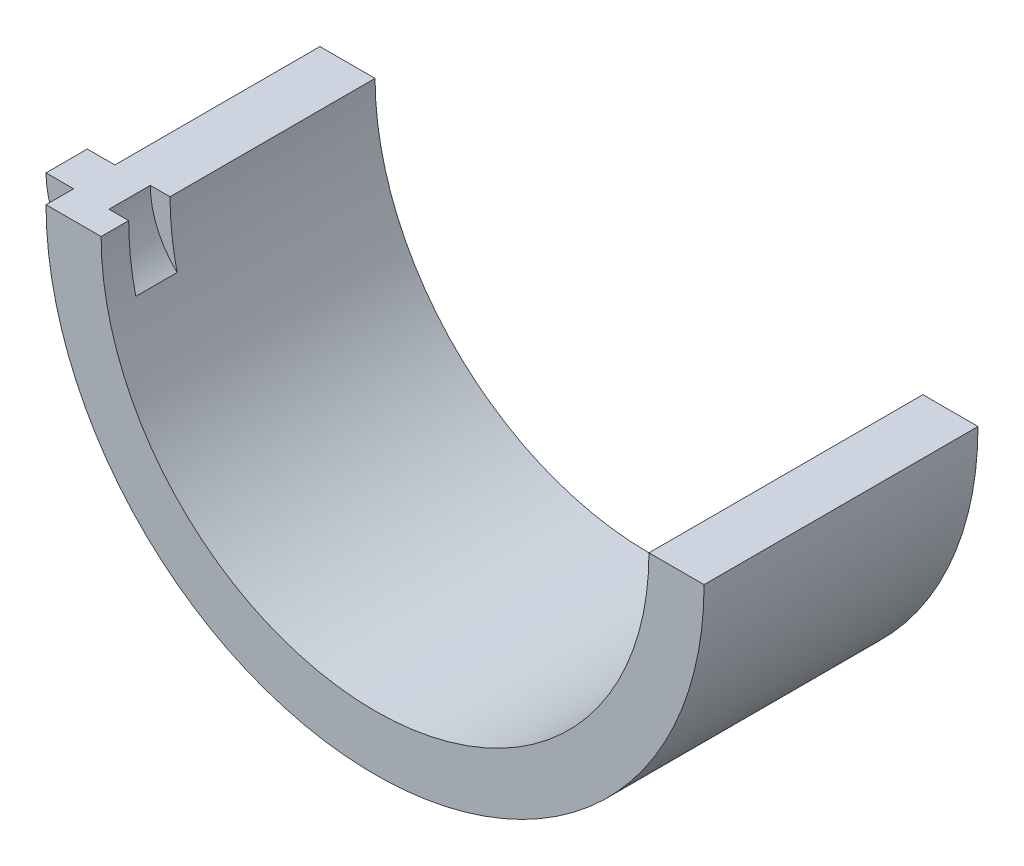
ISO-10303-21;
HEADER;
FILE_DESCRIPTION(('STEP AP214'),'2;1');
FILE_NAME('part.step','',(''),(''),'','','');
FILE_SCHEMA(('AUTOMOTIVE_DESIGN { 1 0 10303 214 1 1 1 1 }'));
ENDSEC;
DATA;
#1=APPLICATION_CONTEXT('core data for automotive mechanical design processes');
#2=APPLICATION_PROTOCOL_DEFINITION('international standard','automotive_design',2000,#1);
#3=PRODUCT_CONTEXT('',#1,'mechanical');
#4=PRODUCT('Part','Part','',(#3));
#5=PRODUCT_RELATED_PRODUCT_CATEGORY('part','',(#4));
#6=PRODUCT_DEFINITION_FORMATION('','',#4);
#7=PRODUCT_DEFINITION_CONTEXT('part definition',#1,'design');
#8=PRODUCT_DEFINITION('design','',#6,#7);
#9=PRODUCT_DEFINITION_SHAPE('','',#8);
#10=(LENGTH_UNIT() NAMED_UNIT(*) SI_UNIT(.MILLI.,.METRE.));
#11=(NAMED_UNIT(*) PLANE_ANGLE_UNIT() SI_UNIT($,.RADIAN.));
#12=(NAMED_UNIT(*) SI_UNIT($,.STERADIAN.) SOLID_ANGLE_UNIT());
#13=UNCERTAINTY_MEASURE_WITH_UNIT(LENGTH_MEASURE(1.E-05),#10,'distance_accuracy_value','');
#14=(GEOMETRIC_REPRESENTATION_CONTEXT(3) GLOBAL_UNCERTAINTY_ASSIGNED_CONTEXT((#13)) GLOBAL_UNIT_ASSIGNED_CONTEXT((#10,
#11,#12)) REPRESENTATION_CONTEXT('',''));
#15=CARTESIAN_POINT('',(0.,0.,0.));
#16=DIRECTION('',(0.,0.,1.));
#17=DIRECTION('',(1.,0.,0.));
#18=AXIS2_PLACEMENT_3D('',#15,#16,#17);
#19=CARTESIAN_POINT('',(0.,15.1638,-12.6238));
#20=DIRECTION('',(0.,0.,1.));
#21=DIRECTION('',(1.,0.,0.));
#22=AXIS2_PLACEMENT_3D('',#19,#20,#21);
#23=CYLINDRICAL_SURFACE('',#22,15.1638);
#24=DIRECTION('',(0.,0.,1.));
#25=VECTOR('',#24,1.);
#26=CARTESIAN_POINT('',(-14.844383501006,12.0678172941278,-3.175));
#27=LINE('',#26,#25);
#28=CARTESIAN_POINT('',(-14.844383501006,12.0678172941278,-3.175));
#29=VERTEX_POINT('',#28);
#30=CARTESIAN_POINT('',(-14.844383501006,12.0678172941278,-1.27));
#31=VERTEX_POINT('',#30);
#32=EDGE_CURVE('E171',#29,#31,#27,.T.);
#33=ORIENTED_EDGE('',*,*,#32,.F.);
#34=CARTESIAN_POINT('',(0.,15.1638,-3.175));
#35=DIRECTION('',(0.,0.,1.));
#36=DIRECTION('',(1.,0.,0.));
#37=AXIS2_PLACEMENT_3D('',#34,#35,#36);
#38=CIRCLE('',#37,15.1638);
#39=CARTESIAN_POINT('',(-15.1638,15.1638,-3.175));
#40=VERTEX_POINT('',#39);
#41=EDGE_CURVE('E162',#40,#29,#38,.T.);
#42=ORIENTED_EDGE('',*,*,#41,.F.);
#43=DIRECTION('',(0.,0.,1.));
#44=VECTOR('',#43,1.);
#45=CARTESIAN_POINT('',(-15.1638,15.1638,-12.6238));
#46=LINE('',#45,#44);
#47=CARTESIAN_POINT('',(-15.1638,15.1638,-12.6238));
#48=VERTEX_POINT('',#47);
#49=EDGE_CURVE('E12',#48,#40,#46,.T.);
#50=ORIENTED_EDGE('',*,*,#49,.F.);
#51=CARTESIAN_POINT('',(0.,15.1638,-12.6238));
#52=DIRECTION('',(0.,0.,1.));
#53=DIRECTION('',(1.,0.,0.));
#54=AXIS2_PLACEMENT_3D('',#51,#52,#53);
#55=CIRCLE('',#54,15.1638);
#56=CARTESIAN_POINT('',(15.1638,15.1638,-12.6238));
#57=VERTEX_POINT('',#56);
#58=EDGE_CURVE('E175',#48,#57,#55,.T.);
#59=ORIENTED_EDGE('',*,*,#58,.T.);
#60=DIRECTION('',(0.,0.,1.));
#61=VECTOR('',#60,1.);
#62=CARTESIAN_POINT('',(15.1638,15.1638,-12.6238));
#63=LINE('',#62,#61);
#64=CARTESIAN_POINT('',(15.1638,15.1638,0.));
#65=VERTEX_POINT('',#64);
#66=EDGE_CURVE('E57',#57,#65,#63,.T.);
#67=ORIENTED_EDGE('',*,*,#66,.T.);
#68=CARTESIAN_POINT('',(0.,15.1638,0.));
#69=DIRECTION('',(0.,0.,1.));
#70=DIRECTION('',(1.,0.,0.));
#71=AXIS2_PLACEMENT_3D('',#68,#69,#70);
#72=CIRCLE('',#71,15.1638);
#73=CARTESIAN_POINT('',(-15.1638,15.1638,0.));
#74=VERTEX_POINT('',#73);
#75=EDGE_CURVE('E173',#74,#65,#72,.T.);
#76=ORIENTED_EDGE('',*,*,#75,.F.);
#77=CARTESIAN_POINT('',(-15.1638,15.1638,-1.27));
#78=VERTEX_POINT('',#77);
#79=EDGE_CURVE('E62',#78,#74,#46,.T.);
#80=ORIENTED_EDGE('',*,*,#79,.F.);
#81=CARTESIAN_POINT('',(0.,15.1638,-1.27));
#82=DIRECTION('',(0.,0.,1.));
#83=DIRECTION('',(1.,0.,0.));
#84=AXIS2_PLACEMENT_3D('',#81,#82,#83);
#85=CIRCLE('',#84,15.1638);
#86=EDGE_CURVE('E159',#78,#31,#85,.T.);
#87=ORIENTED_EDGE('',*,*,#86,.T.);
#88=EDGE_LOOP('',(#33,#42,#50,#59,#67,#76,#80,#87));
#89=FACE_BOUND('',#88,.T.);
#90=ADVANCED_FACE('F54',(#89),#23,.T.);
#91=CARTESIAN_POINT('',(-12.6238,15.1638,-12.6238));
#92=DIRECTION('',(0.,1.,0.));
#93=DIRECTION('',(0.,0.,1.));
#94=AXIS2_PLACEMENT_3D('',#91,#92,#93);
#95=PLANE('',#94);
#96=DIRECTION('',(-1.,0.,0.));
#97=VECTOR('',#96,1.);
#98=CARTESIAN_POINT('',(0.,15.1638,-1.27));
#99=LINE('',#98,#97);
#100=CARTESIAN_POINT('',(-12.6238,15.1638,-1.27));
#101=VERTEX_POINT('',#100);
#102=CARTESIAN_POINT('',(-13.531637370447,15.1638,-1.27));
#103=VERTEX_POINT('',#102);
#104=EDGE_CURVE('E149',#101,#103,#99,.T.);
#105=ORIENTED_EDGE('',*,*,#104,.T.);
#106=DIRECTION('',(0.,0.,1.));
#107=VECTOR('',#106,1.);
#108=CARTESIAN_POINT('',(-13.531637370447,15.1638,-3.175));
#109=LINE('',#108,#107);
#110=CARTESIAN_POINT('',(-13.531637370447,15.1638,-3.175));
#111=VERTEX_POINT('',#110);
#112=EDGE_CURVE('E133',#111,#103,#109,.T.);
#113=ORIENTED_EDGE('',*,*,#112,.F.);
#114=DIRECTION('',(-1.,0.,0.));
#115=VECTOR('',#114,1.);
#116=CARTESIAN_POINT('',(0.,15.1638,-3.175));
#117=LINE('',#116,#115);
#118=CARTESIAN_POINT('',(-12.6238,15.1638,-3.175));
#119=VERTEX_POINT('',#118);
#120=EDGE_CURVE('E139',#119,#111,#117,.T.);
#121=ORIENTED_EDGE('',*,*,#120,.F.);
#122=DIRECTION('',(0.,0.,1.));
#123=VECTOR('',#122,1.);
#124=CARTESIAN_POINT('',(-12.6238,15.1638,-12.6238));
#125=LINE('',#124,#123);
#126=CARTESIAN_POINT('',(-12.6238,15.1638,-12.6238));
#127=VERTEX_POINT('',#126);
#128=EDGE_CURVE('E198',#127,#119,#125,.T.);
#129=ORIENTED_EDGE('',*,*,#128,.F.);
#130=DIRECTION('',(-1.,0.,0.));
#131=VECTOR('',#130,1.);
#132=CARTESIAN_POINT('',(-12.6238,15.1638,-12.6238));
#133=LINE('',#132,#131);
#134=EDGE_CURVE('E185',#127,#48,#133,.T.);
#135=ORIENTED_EDGE('',*,*,#134,.T.);
#136=ORIENTED_EDGE('',*,*,#49,.T.);
#137=DIRECTION('',(-1.,0.,0.));
#138=VECTOR('',#137,1.);
#139=CARTESIAN_POINT('',(-15.1638,15.1638,-3.175));
#140=LINE('',#139,#138);
#141=CARTESIAN_POINT('',(-16.4338,15.1638,-3.175));
#142=VERTEX_POINT('',#141);
#143=EDGE_CURVE('E155',#40,#142,#140,.T.);
#144=ORIENTED_EDGE('',*,*,#143,.T.);
#145=DIRECTION('',(0.,0.,1.));
#146=VECTOR('',#145,1.);
#147=CARTESIAN_POINT('',(-16.4338,15.1638,-3.175));
#148=LINE('',#147,#146);
#149=CARTESIAN_POINT('',(-16.4338,15.1638,-1.27));
#150=VERTEX_POINT('',#149);
#151=EDGE_CURVE('E164',#142,#150,#148,.T.);
#152=ORIENTED_EDGE('',*,*,#151,.T.);
#153=DIRECTION('',(-1.,0.,0.));
#154=VECTOR('',#153,1.);
#155=CARTESIAN_POINT('',(-15.1638,15.1638,-1.27));
#156=LINE('',#155,#154);
#157=EDGE_CURVE('E78',#78,#150,#156,.T.);
#158=ORIENTED_EDGE('',*,*,#157,.F.);
#159=ORIENTED_EDGE('',*,*,#79,.T.);
#160=DIRECTION('',(-1.,0.,0.));
#161=VECTOR('',#160,1.);
#162=CARTESIAN_POINT('',(-12.6238,15.1638,0.));
#163=LINE('',#162,#161);
#164=CARTESIAN_POINT('',(-12.6238,15.1638,0.));
#165=VERTEX_POINT('',#164);
#166=EDGE_CURVE('E179',#165,#74,#163,.T.);
#167=ORIENTED_EDGE('',*,*,#166,.F.);
#168=EDGE_CURVE('E199',#101,#165,#125,.T.);
#169=ORIENTED_EDGE('',*,*,#168,.F.);
#170=EDGE_LOOP('',(#105,#113,#121,#129,#135,#136,#144,#152,#158,#159,#167,#169));
#171=FACE_BOUND('',#170,.T.);
#172=ADVANCED_FACE('F147',(#171),#95,.T.);
#173=CARTESIAN_POINT('',(0.,15.1638,-12.6238));
#174=DIRECTION('',(0.,0.,1.));
#175=DIRECTION('',(1.,0.,0.));
#176=AXIS2_PLACEMENT_3D('',#173,#174,#175);
#177=CYLINDRICAL_SURFACE('',#176,12.6238);
#178=CARTESIAN_POINT('',(0.,15.1638,-1.27));
#179=DIRECTION('',(0.,0.,1.));
#180=DIRECTION('',(1.,0.,0.));
#181=AXIS2_PLACEMENT_3D('',#178,#179,#180);
#182=CIRCLE('',#181,12.6238);
#183=CARTESIAN_POINT('',(-12.2955590500045,12.3038080266107,-1.27));
#184=VERTEX_POINT('',#183);
#185=EDGE_CURVE('E144',#101,#184,#182,.T.);
#186=ORIENTED_EDGE('',*,*,#185,.F.);
#187=ORIENTED_EDGE('',*,*,#168,.T.);
#188=CARTESIAN_POINT('',(0.,15.1638,0.));
#189=DIRECTION('',(0.,0.,-1.));
#190=DIRECTION('',(-1.,0.,0.));
#191=AXIS2_PLACEMENT_3D('',#188,#189,#190);
#192=CIRCLE('',#191,12.6238);
#193=CARTESIAN_POINT('',(12.6238,15.1638,0.));
#194=VERTEX_POINT('',#193);
#195=EDGE_CURVE('E193',#194,#165,#192,.T.);
#196=ORIENTED_EDGE('',*,*,#195,.F.);
#197=DIRECTION('',(0.,0.,1.));
#198=VECTOR('',#197,1.);
#199=CARTESIAN_POINT('',(12.6238,15.1638,-12.6238));
#200=LINE('',#199,#198);
#201=CARTESIAN_POINT('',(12.6238,15.1638,-12.6238));
#202=VERTEX_POINT('',#201);
#203=EDGE_CURVE('E200',#202,#194,#200,.T.);
#204=ORIENTED_EDGE('',*,*,#203,.F.);
#205=CARTESIAN_POINT('',(0.,15.1638,-12.6238));
#206=DIRECTION('',(0.,0.,-1.));
#207=DIRECTION('',(-1.,0.,0.));
#208=AXIS2_PLACEMENT_3D('',#205,#206,#207);
#209=CIRCLE('',#208,12.6238);
#210=EDGE_CURVE('E182',#202,#127,#209,.T.);
#211=ORIENTED_EDGE('',*,*,#210,.T.);
#212=ORIENTED_EDGE('',*,*,#128,.T.);
#213=CARTESIAN_POINT('',(0.,15.1638,-3.175));
#214=DIRECTION('',(0.,0.,1.));
#215=DIRECTION('',(1.,0.,0.));
#216=AXIS2_PLACEMENT_3D('',#213,#214,#215);
#217=CIRCLE('',#216,12.6238);
#218=CARTESIAN_POINT('',(-12.2955590500045,12.3038080266107,-3.175));
#219=VERTEX_POINT('',#218);
#220=EDGE_CURVE('E138',#119,#219,#217,.T.);
#221=ORIENTED_EDGE('',*,*,#220,.T.);
#222=DIRECTION('',(0.,0.,1.));
#223=VECTOR('',#222,1.);
#224=CARTESIAN_POINT('',(-12.2955590500045,12.3038080266107,-3.175));
#225=LINE('',#224,#223);
#226=EDGE_CURVE('E136',#219,#184,#225,.T.);
#227=ORIENTED_EDGE('',*,*,#226,.T.);
#228=EDGE_LOOP('',(#186,#187,#196,#204,#211,#212,#221,#227));
#229=FACE_BOUND('',#228,.T.);
#230=ADVANCED_FACE('F229',(#229),#177,.F.);
#231=CARTESIAN_POINT('',(12.6238,15.1638,-12.6238));
#232=DIRECTION('',(0.,1.,0.));
#233=DIRECTION('',(0.,0.,1.));
#234=AXIS2_PLACEMENT_3D('',#231,#232,#233);
#235=PLANE('',#234);
#236=DIRECTION('',(-1.,0.,0.));
#237=VECTOR('',#236,1.);
#238=CARTESIAN_POINT('',(12.6238,15.1638,0.));
#239=LINE('',#238,#237);
#240=EDGE_CURVE('E190',#65,#194,#239,.T.);
#241=ORIENTED_EDGE('',*,*,#240,.F.);
#242=ORIENTED_EDGE('',*,*,#66,.F.);
#243=DIRECTION('',(-1.,0.,0.));
#244=VECTOR('',#243,1.);
#245=CARTESIAN_POINT('',(12.6238,15.1638,-12.6238));
#246=LINE('',#245,#244);
#247=EDGE_CURVE('E178',#57,#202,#246,.T.);
#248=ORIENTED_EDGE('',*,*,#247,.T.);
#249=ORIENTED_EDGE('',*,*,#203,.T.);
#250=EDGE_LOOP('',(#241,#242,#248,#249));
#251=FACE_BOUND('',#250,.T.);
#252=ADVANCED_FACE('F210',(#251),#235,.T.);
#253=CARTESIAN_POINT('',(0.,15.1638,-12.6238));
#254=DIRECTION('',(0.,0.,1.));
#255=DIRECTION('',(1.,0.,0.));
#256=AXIS2_PLACEMENT_3D('',#253,#254,#255);
#257=PLANE('',#256);
#258=ORIENTED_EDGE('',*,*,#58,.F.);
#259=ORIENTED_EDGE('',*,*,#134,.F.);
#260=ORIENTED_EDGE('',*,*,#210,.F.);
#261=ORIENTED_EDGE('',*,*,#247,.F.);
#262=EDGE_LOOP('',(#258,#259,#260,#261));
#263=FACE_BOUND('',#262,.T.);
#264=ADVANCED_FACE('F225',(#263),#257,.F.);
#265=CARTESIAN_POINT('',(0.,15.1638,0.));
#266=DIRECTION('',(0.,0.,1.));
#267=DIRECTION('',(1.,0.,0.));
#268=AXIS2_PLACEMENT_3D('',#265,#266,#267);
#269=PLANE('',#268);
#270=ORIENTED_EDGE('',*,*,#75,.T.);
#271=ORIENTED_EDGE('',*,*,#240,.T.);
#272=ORIENTED_EDGE('',*,*,#195,.T.);
#273=ORIENTED_EDGE('',*,*,#166,.T.);
#274=EDGE_LOOP('',(#270,#271,#272,#273));
#275=FACE_BOUND('',#274,.T.);
#276=ADVANCED_FACE('F212',(#275),#269,.T.);
#277=CARTESIAN_POINT('',(-12.6238,15.1638,-3.175));
#278=DIRECTION('',(0.,0.,1.));
#279=DIRECTION('',(1.,0.,0.));
#280=AXIS2_PLACEMENT_3D('',#277,#278,#279);
#281=CYLINDRICAL_SURFACE('',#280,3.81);
#282=CARTESIAN_POINT('',(-12.6238,15.1638,-1.27));
#283=DIRECTION('',(0.,0.,1.));
#284=DIRECTION('',(1.,0.,0.));
#285=AXIS2_PLACEMENT_3D('',#282,#283,#284);
#286=CIRCLE('',#285,3.81);
#287=EDGE_CURVE('E166',#150,#31,#286,.T.);
#288=ORIENTED_EDGE('',*,*,#287,.F.);
#289=ORIENTED_EDGE('',*,*,#151,.F.);
#290=CARTESIAN_POINT('',(-12.6238,15.1638,-3.175));
#291=DIRECTION('',(0.,0.,1.));
#292=DIRECTION('',(1.,0.,0.));
#293=AXIS2_PLACEMENT_3D('',#290,#291,#292);
#294=CIRCLE('',#293,3.81);
#295=EDGE_CURVE('E158',#142,#29,#294,.T.);
#296=ORIENTED_EDGE('',*,*,#295,.T.);
#297=ORIENTED_EDGE('',*,*,#32,.T.);
#298=EDGE_LOOP('',(#288,#289,#296,#297));
#299=FACE_BOUND('',#298,.T.);
#300=ADVANCED_FACE('F219',(#299),#281,.T.);
#301=CARTESIAN_POINT('',(-12.6238,15.1638,-3.175));
#302=DIRECTION('',(0.,0.,1.));
#303=DIRECTION('',(1.,0.,0.));
#304=AXIS2_PLACEMENT_3D('',#301,#302,#303);
#305=PLANE('',#304);
#306=ORIENTED_EDGE('',*,*,#143,.F.);
#307=ORIENTED_EDGE('',*,*,#41,.T.);
#308=ORIENTED_EDGE('',*,*,#295,.F.);
#309=EDGE_LOOP('',(#306,#307,#308));
#310=FACE_BOUND('',#309,.T.);
#311=ADVANCED_FACE('F222',(#310),#305,.F.);
#312=CARTESIAN_POINT('',(-12.6238,15.1638,-1.27));
#313=DIRECTION('',(0.,0.,1.));
#314=DIRECTION('',(1.,0.,0.));
#315=AXIS2_PLACEMENT_3D('',#312,#313,#314);
#316=PLANE('',#315);
#317=ORIENTED_EDGE('',*,*,#157,.T.);
#318=ORIENTED_EDGE('',*,*,#287,.T.);
#319=ORIENTED_EDGE('',*,*,#86,.F.);
#320=EDGE_LOOP('',(#317,#318,#319));
#321=FACE_BOUND('',#320,.T.);
#322=ADVANCED_FACE('F216',(#321),#316,.T.);
#323=CARTESIAN_POINT('',(0.,0.,-1.27));
#324=DIRECTION('',(0.,0.,1.));
#325=DIRECTION('',(1.,0.,0.));
#326=AXIS2_PLACEMENT_3D('',#323,#324,#325);
#327=PLANE('',#326);
#328=ORIENTED_EDGE('',*,*,#104,.F.);
#329=ORIENTED_EDGE('',*,*,#185,.T.);
#330=CARTESIAN_POINT('',(-9.60492676417865,15.1638,-1.27));
#331=DIRECTION('',(0.,0.,1.));
#332=DIRECTION('',(1.,0.,0.));
#333=AXIS2_PLACEMENT_3D('',#330,#331,#332);
#334=CIRCLE('',#333,3.92671060626832);
#335=EDGE_CURVE('E231',#103,#184,#334,.T.);
#336=ORIENTED_EDGE('',*,*,#335,.F.);
#337=EDGE_LOOP('',(#328,#329,#336));
#338=FACE_BOUND('',#337,.T.);
#339=ADVANCED_FACE('F234',(#338),#327,.F.);
#340=CARTESIAN_POINT('',(-9.60492676417865,15.1638,-3.175));
#341=DIRECTION('',(0.,0.,1.));
#342=DIRECTION('',(1.,0.,0.));
#343=AXIS2_PLACEMENT_3D('',#340,#341,#342);
#344=CYLINDRICAL_SURFACE('',#343,3.92671060626832);
#345=ORIENTED_EDGE('',*,*,#335,.T.);
#346=ORIENTED_EDGE('',*,*,#226,.F.);
#347=CARTESIAN_POINT('',(-9.60492676417865,15.1638,-3.175));
#348=DIRECTION('',(0.,0.,1.));
#349=DIRECTION('',(1.,0.,0.));
#350=AXIS2_PLACEMENT_3D('',#347,#348,#349);
#351=CIRCLE('',#350,3.92671060626832);
#352=EDGE_CURVE('E70',#111,#219,#351,.T.);
#353=ORIENTED_EDGE('',*,*,#352,.F.);
#354=ORIENTED_EDGE('',*,*,#112,.T.);
#355=EDGE_LOOP('',(#345,#346,#353,#354));
#356=FACE_BOUND('',#355,.T.);
#357=ADVANCED_FACE('F131',(#356),#344,.F.);
#358=CARTESIAN_POINT('',(0.,0.,-3.175));
#359=DIRECTION('',(0.,0.,1.));
#360=DIRECTION('',(1.,0.,0.));
#361=AXIS2_PLACEMENT_3D('',#358,#359,#360);
#362=PLANE('',#361);
#363=ORIENTED_EDGE('',*,*,#120,.T.);
#364=ORIENTED_EDGE('',*,*,#352,.T.);
#365=ORIENTED_EDGE('',*,*,#220,.F.);
#366=EDGE_LOOP('',(#363,#364,#365));
#367=FACE_BOUND('',#366,.T.);
#368=ADVANCED_FACE('F142',(#367),#362,.T.);
#369=CLOSED_SHELL('',(#90,#172,#230,#252,#264,#276,#300,#311,#322,#339,#357,#368));
#370=MANIFOLD_SOLID_BREP('B2',#369);
#371=ADVANCED_BREP_SHAPE_REPRESENTATION('',(#18,#370),#14);
#372=SHAPE_DEFINITION_REPRESENTATION(#9,#371);
ENDSEC;
END-ISO-10303-21;
